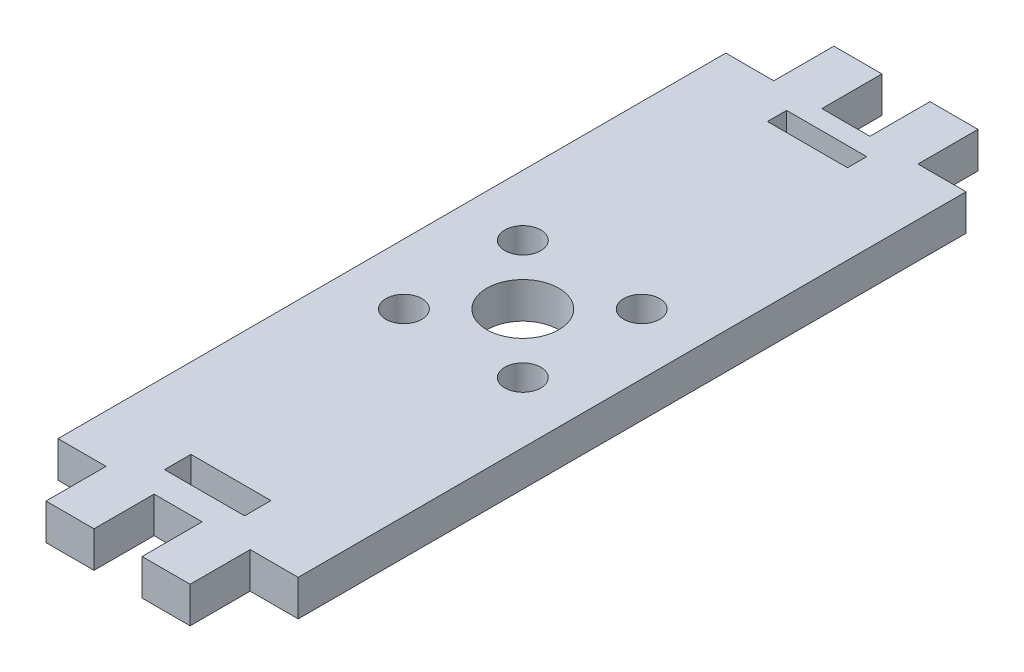
ISO-10303-21;
HEADER;
FILE_DESCRIPTION(('STEP AP214'),'2;1');
FILE_NAME('part.step','',(''),(''),'','','');
FILE_SCHEMA(('AUTOMOTIVE_DESIGN { 1 0 10303 214 1 1 1 1 }'));
ENDSEC;
DATA;
#1=APPLICATION_CONTEXT('core data for automotive mechanical design processes');
#2=APPLICATION_PROTOCOL_DEFINITION('international standard','automotive_design',2000,#1);
#3=PRODUCT_CONTEXT('',#1,'mechanical');
#4=PRODUCT('Part','Part','',(#3));
#5=PRODUCT_RELATED_PRODUCT_CATEGORY('part','',(#4));
#6=PRODUCT_DEFINITION_FORMATION('','',#4);
#7=PRODUCT_DEFINITION_CONTEXT('part definition',#1,'design');
#8=PRODUCT_DEFINITION('design','',#6,#7);
#9=PRODUCT_DEFINITION_SHAPE('','',#8);
#10=(LENGTH_UNIT() NAMED_UNIT(*) SI_UNIT(.MILLI.,.METRE.));
#11=(NAMED_UNIT(*) PLANE_ANGLE_UNIT() SI_UNIT($,.RADIAN.));
#12=(NAMED_UNIT(*) SI_UNIT($,.STERADIAN.) SOLID_ANGLE_UNIT());
#13=UNCERTAINTY_MEASURE_WITH_UNIT(LENGTH_MEASURE(1.E-05),#10,'distance_accuracy_value','');
#14=(GEOMETRIC_REPRESENTATION_CONTEXT(3) GLOBAL_UNCERTAINTY_ASSIGNED_CONTEXT((#13)) GLOBAL_UNIT_ASSIGNED_CONTEXT((#10,
#11,#12)) REPRESENTATION_CONTEXT('',''));
#15=CARTESIAN_POINT('',(0.,0.,0.));
#16=DIRECTION('',(0.,0.,1.));
#17=DIRECTION('',(1.,0.,0.));
#18=AXIS2_PLACEMENT_3D('',#15,#16,#17);
#19=CARTESIAN_POINT('',(-20.,3.,55.6));
#20=DIRECTION('',(0.,0.,-1.));
#21=DIRECTION('',(-1.,0.,0.));
#22=AXIS2_PLACEMENT_3D('',#19,#20,#21);
#23=PLANE('',#22);
#24=DIRECTION('',(0.,1.,0.));
#25=VECTOR('',#24,1.);
#26=CARTESIAN_POINT('',(-12.,0.,55.6));
#27=LINE('',#26,#25);
#28=CARTESIAN_POINT('',(-12.,0.,55.6));
#29=VERTEX_POINT('',#28);
#30=CARTESIAN_POINT('',(-12.,3.,55.6));
#31=VERTEX_POINT('',#30);
#32=EDGE_CURVE('E309',#29,#31,#27,.T.);
#33=ORIENTED_EDGE('',*,*,#32,.F.);
#34=DIRECTION('',(1.,0.,0.));
#35=VECTOR('',#34,1.);
#36=CARTESIAN_POINT('',(-20.,0.,55.6));
#37=LINE('',#36,#35);
#38=CARTESIAN_POINT('',(-8.,0.,55.6));
#39=VERTEX_POINT('',#38);
#40=EDGE_CURVE('E420',#29,#39,#37,.T.);
#41=ORIENTED_EDGE('',*,*,#40,.T.);
#42=DIRECTION('',(0.,1.,0.));
#43=VECTOR('',#42,1.);
#44=CARTESIAN_POINT('',(-8.,0.,55.6));
#45=LINE('',#44,#43);
#46=CARTESIAN_POINT('',(-8.,3.,55.6));
#47=VERTEX_POINT('',#46);
#48=EDGE_CURVE('E328',#39,#47,#45,.T.);
#49=ORIENTED_EDGE('',*,*,#48,.T.);
#50=DIRECTION('',(1.,0.,0.));
#51=VECTOR('',#50,1.);
#52=CARTESIAN_POINT('',(-20.,3.,55.6));
#53=LINE('',#52,#51);
#54=EDGE_CURVE('E406',#31,#47,#53,.T.);
#55=ORIENTED_EDGE('',*,*,#54,.F.);
#56=EDGE_LOOP('',(#33,#41,#49,#55));
#57=FACE_BOUND('',#56,.T.);
#58=ADVANCED_FACE('F40',(#57),#23,.F.);
#59=DIRECTION('',(0.,1.,0.));
#60=VECTOR('',#59,1.);
#61=CARTESIAN_POINT('',(-4.,0.,55.6));
#62=LINE('',#61,#60);
#63=CARTESIAN_POINT('',(-4.,0.,55.6));
#64=VERTEX_POINT('',#63);
#65=CARTESIAN_POINT('',(-4.,3.,55.6));
#66=VERTEX_POINT('',#65);
#67=EDGE_CURVE('E336',#64,#66,#62,.T.);
#68=ORIENTED_EDGE('',*,*,#67,.F.);
#69=CARTESIAN_POINT('',(0.,0.,55.6));
#70=VERTEX_POINT('',#69);
#71=EDGE_CURVE('E416',#64,#70,#37,.T.);
#72=ORIENTED_EDGE('',*,*,#71,.T.);
#73=DIRECTION('',(0.,-1.,0.));
#74=VECTOR('',#73,1.);
#75=CARTESIAN_POINT('',(0.,3.,55.6));
#76=LINE('',#75,#74);
#77=CARTESIAN_POINT('',(0.,3.,55.6));
#78=VERTEX_POINT('',#77);
#79=EDGE_CURVE('E431',#78,#70,#76,.T.);
#80=ORIENTED_EDGE('',*,*,#79,.F.);
#81=EDGE_CURVE('E400',#66,#78,#53,.T.);
#82=ORIENTED_EDGE('',*,*,#81,.F.);
#83=EDGE_LOOP('',(#68,#72,#80,#82));
#84=FACE_BOUND('',#83,.T.);
#85=ADVANCED_FACE('F485',(#84),#23,.F.);
#86=CARTESIAN_POINT('',(-20.,3.,0.));
#87=DIRECTION('',(0.,0.,1.));
#88=DIRECTION('',(1.,0.,0.));
#89=AXIS2_PLACEMENT_3D('',#86,#87,#88);
#90=PLANE('',#89);
#91=DIRECTION('',(0.,1.,0.));
#92=VECTOR('',#91,1.);
#93=CARTESIAN_POINT('',(-16.,0.,0.));
#94=LINE('',#93,#92);
#95=CARTESIAN_POINT('',(-16.,0.,0.));
#96=VERTEX_POINT('',#95);
#97=CARTESIAN_POINT('',(-16.,3.,0.));
#98=VERTEX_POINT('',#97);
#99=EDGE_CURVE('E363',#96,#98,#94,.T.);
#100=ORIENTED_EDGE('',*,*,#99,.F.);
#101=DIRECTION('',(-1.,0.,0.));
#102=VECTOR('',#101,1.);
#103=CARTESIAN_POINT('',(-20.,0.,0.));
#104=LINE('',#103,#102);
#105=CARTESIAN_POINT('',(-20.,0.,0.));
#106=VERTEX_POINT('',#105);
#107=EDGE_CURVE('E422',#96,#106,#104,.T.);
#108=ORIENTED_EDGE('',*,*,#107,.T.);
#109=DIRECTION('',(0.,-1.,0.));
#110=VECTOR('',#109,1.);
#111=CARTESIAN_POINT('',(-20.,3.,0.));
#112=LINE('',#111,#110);
#113=CARTESIAN_POINT('',(-20.,3.,0.));
#114=VERTEX_POINT('',#113);
#115=EDGE_CURVE('E412',#114,#106,#112,.T.);
#116=ORIENTED_EDGE('',*,*,#115,.F.);
#117=DIRECTION('',(-1.,0.,0.));
#118=VECTOR('',#117,1.);
#119=CARTESIAN_POINT('',(-20.,3.,0.));
#120=LINE('',#119,#118);
#121=EDGE_CURVE('E408',#98,#114,#120,.T.);
#122=ORIENTED_EDGE('',*,*,#121,.F.);
#123=EDGE_LOOP('',(#100,#108,#116,#122));
#124=FACE_BOUND('',#123,.T.);
#125=ADVANCED_FACE('F491',(#124),#90,.F.);
#126=CARTESIAN_POINT('',(-8.,0.,0.));
#127=VERTEX_POINT('',#126);
#128=CARTESIAN_POINT('',(-12.,0.,0.));
#129=VERTEX_POINT('',#128);
#130=EDGE_CURVE('E425',#127,#129,#104,.T.);
#131=ORIENTED_EDGE('',*,*,#130,.T.);
#132=DIRECTION('',(0.,1.,0.));
#133=VECTOR('',#132,1.);
#134=CARTESIAN_POINT('',(-12.,0.,0.));
#135=LINE('',#134,#133);
#136=CARTESIAN_POINT('',(-12.,3.,0.));
#137=VERTEX_POINT('',#136);
#138=EDGE_CURVE('E355',#129,#137,#135,.T.);
#139=ORIENTED_EDGE('',*,*,#138,.T.);
#140=CARTESIAN_POINT('',(-8.,3.,0.));
#141=VERTEX_POINT('',#140);
#142=EDGE_CURVE('E413',#141,#137,#120,.T.);
#143=ORIENTED_EDGE('',*,*,#142,.F.);
#144=DIRECTION('',(0.,1.,0.));
#145=VECTOR('',#144,1.);
#146=CARTESIAN_POINT('',(-8.,0.,0.));
#147=LINE('',#146,#145);
#148=EDGE_CURVE('E393',#127,#141,#147,.T.);
#149=ORIENTED_EDGE('',*,*,#148,.F.);
#150=EDGE_LOOP('',(#131,#139,#143,#149));
#151=FACE_BOUND('',#150,.T.);
#152=ADVANCED_FACE('F504',(#151),#90,.F.);
#153=CARTESIAN_POINT('',(-20.,3.,0.));
#154=DIRECTION('',(1.,0.,0.));
#155=DIRECTION('',(0.,0.,-1.));
#156=AXIS2_PLACEMENT_3D('',#153,#154,#155);
#157=PLANE('',#156);
#158=DIRECTION('',(0.,0.,1.));
#159=VECTOR('',#158,1.);
#160=CARTESIAN_POINT('',(-20.,0.,0.));
#161=LINE('',#160,#159);
#162=CARTESIAN_POINT('',(-20.,0.,55.6));
#163=VERTEX_POINT('',#162);
#164=EDGE_CURVE('E389',#106,#163,#161,.T.);
#165=ORIENTED_EDGE('',*,*,#164,.T.);
#166=DIRECTION('',(0.,-1.,0.));
#167=VECTOR('',#166,1.);
#168=CARTESIAN_POINT('',(-20.,3.,55.6));
#169=LINE('',#168,#167);
#170=CARTESIAN_POINT('',(-20.,3.,55.6));
#171=VERTEX_POINT('',#170);
#172=EDGE_CURVE('E434',#171,#163,#169,.T.);
#173=ORIENTED_EDGE('',*,*,#172,.F.);
#174=DIRECTION('',(0.,0.,1.));
#175=VECTOR('',#174,1.);
#176=CARTESIAN_POINT('',(-20.,3.,0.));
#177=LINE('',#176,#175);
#178=EDGE_CURVE('E397',#114,#171,#177,.T.);
#179=ORIENTED_EDGE('',*,*,#178,.F.);
#180=ORIENTED_EDGE('',*,*,#115,.T.);
#181=EDGE_LOOP('',(#165,#173,#179,#180));
#182=FACE_BOUND('',#181,.T.);
#183=ADVANCED_FACE('F42',(#182),#157,.F.);
#184=CARTESIAN_POINT('',(-16.,0.,55.6));
#185=VERTEX_POINT('',#184);
#186=EDGE_CURVE('E417',#163,#185,#37,.T.);
#187=ORIENTED_EDGE('',*,*,#186,.T.);
#188=DIRECTION('',(0.,1.,0.));
#189=VECTOR('',#188,1.);
#190=CARTESIAN_POINT('',(-16.,0.,55.6));
#191=LINE('',#190,#189);
#192=CARTESIAN_POINT('',(-16.,3.,55.6));
#193=VERTEX_POINT('',#192);
#194=EDGE_CURVE('E300',#185,#193,#191,.T.);
#195=ORIENTED_EDGE('',*,*,#194,.T.);
#196=EDGE_CURVE('E402',#171,#193,#53,.T.);
#197=ORIENTED_EDGE('',*,*,#196,.F.);
#198=ORIENTED_EDGE('',*,*,#172,.T.);
#199=EDGE_LOOP('',(#187,#195,#197,#198));
#200=FACE_BOUND('',#199,.T.);
#201=ADVANCED_FACE('F487',(#200),#23,.F.);
#202=CARTESIAN_POINT('',(0.,3.,0.));
#203=DIRECTION('',(-1.,0.,0.));
#204=DIRECTION('',(0.,0.,1.));
#205=AXIS2_PLACEMENT_3D('',#202,#203,#204);
#206=PLANE('',#205);
#207=DIRECTION('',(0.,0.,-1.));
#208=VECTOR('',#207,1.);
#209=CARTESIAN_POINT('',(0.,0.,0.));
#210=LINE('',#209,#208);
#211=CARTESIAN_POINT('',(0.,0.,0.));
#212=VERTEX_POINT('',#211);
#213=EDGE_CURVE('E419',#70,#212,#210,.T.);
#214=ORIENTED_EDGE('',*,*,#213,.T.);
#215=DIRECTION('',(0.,-1.,0.));
#216=VECTOR('',#215,1.);
#217=CARTESIAN_POINT('',(0.,3.,0.));
#218=LINE('',#217,#216);
#219=CARTESIAN_POINT('',(0.,3.,0.));
#220=VERTEX_POINT('',#219);
#221=EDGE_CURVE('E428',#220,#212,#218,.T.);
#222=ORIENTED_EDGE('',*,*,#221,.F.);
#223=DIRECTION('',(0.,0.,-1.));
#224=VECTOR('',#223,1.);
#225=CARTESIAN_POINT('',(0.,3.,0.));
#226=LINE('',#225,#224);
#227=EDGE_CURVE('E405',#78,#220,#226,.T.);
#228=ORIENTED_EDGE('',*,*,#227,.F.);
#229=ORIENTED_EDGE('',*,*,#79,.T.);
#230=EDGE_LOOP('',(#214,#222,#228,#229));
#231=FACE_BOUND('',#230,.T.);
#232=ADVANCED_FACE('F496',(#231),#206,.F.);
#233=CARTESIAN_POINT('',(-4.,0.,0.));
#234=VERTEX_POINT('',#233);
#235=EDGE_CURVE('E401',#212,#234,#104,.T.);
#236=ORIENTED_EDGE('',*,*,#235,.T.);
#237=DIRECTION('',(0.,1.,0.));
#238=VECTOR('',#237,1.);
#239=CARTESIAN_POINT('',(-4.,0.,0.));
#240=LINE('',#239,#238);
#241=CARTESIAN_POINT('',(-4.,3.,0.));
#242=VERTEX_POINT('',#241);
#243=EDGE_CURVE('E390',#234,#242,#240,.T.);
#244=ORIENTED_EDGE('',*,*,#243,.T.);
#245=EDGE_CURVE('E409',#220,#242,#120,.T.);
#246=ORIENTED_EDGE('',*,*,#245,.F.);
#247=ORIENTED_EDGE('',*,*,#221,.T.);
#248=EDGE_LOOP('',(#236,#244,#246,#247));
#249=FACE_BOUND('',#248,.T.);
#250=ADVANCED_FACE('F502',(#249),#90,.F.);
#251=CARTESIAN_POINT('',(0.,3.,0.));
#252=DIRECTION('',(0.,1.,0.));
#253=DIRECTION('',(0.,0.,1.));
#254=AXIS2_PLACEMENT_3D('',#251,#252,#253);
#255=PLANE('',#254);
#256=DIRECTION('',(-1.,0.,0.));
#257=VECTOR('',#256,1.);
#258=CARTESIAN_POINT('',(0.,3.,1.6));
#259=LINE('',#258,#257);
#260=CARTESIAN_POINT('',(-6.66666666666667,3.,1.6));
#261=VERTEX_POINT('',#260);
#262=CARTESIAN_POINT('',(-13.3333333333333,3.,1.6));
#263=VERTEX_POINT('',#262);
#264=EDGE_CURVE('E55',#261,#263,#259,.T.);
#265=ORIENTED_EDGE('',*,*,#264,.F.);
#266=DIRECTION('',(0.,0.,1.));
#267=VECTOR('',#266,1.);
#268=CARTESIAN_POINT('',(-6.66666666666667,3.,0.));
#269=LINE('',#268,#267);
#270=CARTESIAN_POINT('',(-6.66666666666667,3.,3.2));
#271=VERTEX_POINT('',#270);
#272=EDGE_CURVE('E249',#261,#271,#269,.T.);
#273=ORIENTED_EDGE('',*,*,#272,.T.);
#274=DIRECTION('',(-1.,0.,0.));
#275=VECTOR('',#274,1.);
#276=CARTESIAN_POINT('',(0.,3.,3.2));
#277=LINE('',#276,#275);
#278=CARTESIAN_POINT('',(-13.3333333333333,3.,3.2));
#279=VERTEX_POINT('',#278);
#280=EDGE_CURVE('E232',#271,#279,#277,.T.);
#281=ORIENTED_EDGE('',*,*,#280,.T.);
#282=DIRECTION('',(0.,0.,1.));
#283=VECTOR('',#282,1.);
#284=CARTESIAN_POINT('',(-13.3333333333333,3.,0.));
#285=LINE('',#284,#283);
#286=EDGE_CURVE('E242',#263,#279,#285,.T.);
#287=ORIENTED_EDGE('',*,*,#286,.F.);
#288=EDGE_LOOP('',(#265,#273,#281,#287));
#289=FACE_BOUND('',#288,.T.);
#290=DIRECTION('',(-1.,0.,0.));
#291=VECTOR('',#290,1.);
#292=CARTESIAN_POINT('',(0.,3.,51.2));
#293=LINE('',#292,#291);
#294=CARTESIAN_POINT('',(-6.66666666666666,3.,51.2));
#295=VERTEX_POINT('',#294);
#296=CARTESIAN_POINT('',(-13.3333333333333,3.,51.2));
#297=VERTEX_POINT('',#296);
#298=EDGE_CURVE('E63',#295,#297,#293,.T.);
#299=ORIENTED_EDGE('',*,*,#298,.F.);
#300=DIRECTION('',(0.,0.,1.));
#301=VECTOR('',#300,1.);
#302=CARTESIAN_POINT('',(-6.66666666666666,3.,0.));
#303=LINE('',#302,#301);
#304=CARTESIAN_POINT('',(-6.66666666666666,3.,53.4));
#305=VERTEX_POINT('',#304);
#306=EDGE_CURVE('E271',#295,#305,#303,.T.);
#307=ORIENTED_EDGE('',*,*,#306,.T.);
#308=DIRECTION('',(-1.,0.,0.));
#309=VECTOR('',#308,1.);
#310=CARTESIAN_POINT('',(0.,3.,53.4));
#311=LINE('',#310,#309);
#312=CARTESIAN_POINT('',(-13.3333333333333,3.,53.4));
#313=VERTEX_POINT('',#312);
#314=EDGE_CURVE('E268',#305,#313,#311,.T.);
#315=ORIENTED_EDGE('',*,*,#314,.T.);
#316=DIRECTION('',(0.,0.,1.));
#317=VECTOR('',#316,1.);
#318=CARTESIAN_POINT('',(-13.3333333333333,3.,0.));
#319=LINE('',#318,#317);
#320=EDGE_CURVE('E265',#297,#313,#319,.T.);
#321=ORIENTED_EDGE('',*,*,#320,.F.);
#322=EDGE_LOOP('',(#299,#307,#315,#321));
#323=FACE_BOUND('',#322,.T.);
#324=CARTESIAN_POINT('',(-14.9497474683058,3.,31.8497474683058));
#325=DIRECTION('',(0.,1.,0.));
#326=DIRECTION('',(0.,0.,1.));
#327=AXIS2_PLACEMENT_3D('',#324,#325,#326);
#328=CIRCLE('',#327,1.5);
#329=CARTESIAN_POINT('',(-14.9497474683058,3.,33.3497474683058));
#330=VERTEX_POINT('',#329);
#331=EDGE_CURVE('E259',#330,#330,#328,.T.);
#332=ORIENTED_EDGE('',*,*,#331,.F.);
#333=EDGE_LOOP('',(#332));
#334=FACE_BOUND('',#333,.T.);
#335=CARTESIAN_POINT('',(-14.9497474683058,3.,21.9502525316942));
#336=DIRECTION('',(0.,1.,0.));
#337=DIRECTION('',(0.,0.,1.));
#338=AXIS2_PLACEMENT_3D('',#335,#336,#337);
#339=CIRCLE('',#338,1.5);
#340=CARTESIAN_POINT('',(-14.9497474683058,3.,23.4502525316942));
#341=VERTEX_POINT('',#340);
#342=EDGE_CURVE('E262',#341,#341,#339,.T.);
#343=ORIENTED_EDGE('',*,*,#342,.F.);
#344=EDGE_LOOP('',(#343));
#345=FACE_BOUND('',#344,.T.);
#346=CARTESIAN_POINT('',(-10.,3.,26.9));
#347=DIRECTION('',(0.,1.,0.));
#348=DIRECTION('',(0.,0.,1.));
#349=AXIS2_PLACEMENT_3D('',#346,#347,#348);
#350=CIRCLE('',#349,3.);
#351=CARTESIAN_POINT('',(-10.,3.,29.9));
#352=VERTEX_POINT('',#351);
#353=EDGE_CURVE('E287',#352,#352,#350,.T.);
#354=ORIENTED_EDGE('',*,*,#353,.F.);
#355=EDGE_LOOP('',(#354));
#356=FACE_BOUND('',#355,.T.);
#357=CARTESIAN_POINT('',(-5.05025253169417,3.,31.8497474683058));
#358=DIRECTION('',(0.,1.,0.));
#359=DIRECTION('',(0.,0.,1.));
#360=AXIS2_PLACEMENT_3D('',#357,#358,#359);
#361=CIRCLE('',#360,1.5);
#362=CARTESIAN_POINT('',(-5.05025253169417,3.,33.3497474683058));
#363=VERTEX_POINT('',#362);
#364=EDGE_CURVE('E284',#363,#363,#361,.T.);
#365=ORIENTED_EDGE('',*,*,#364,.F.);
#366=EDGE_LOOP('',(#365));
#367=FACE_BOUND('',#366,.T.);
#368=CARTESIAN_POINT('',(-5.05025253169417,3.,21.9502525316942));
#369=DIRECTION('',(0.,1.,0.));
#370=DIRECTION('',(0.,0.,1.));
#371=AXIS2_PLACEMENT_3D('',#368,#369,#370);
#372=CIRCLE('',#371,1.5);
#373=CARTESIAN_POINT('',(-5.05025253169417,3.,23.4502525316942));
#374=VERTEX_POINT('',#373);
#375=EDGE_CURVE('E281',#374,#374,#372,.T.);
#376=ORIENTED_EDGE('',*,*,#375,.F.);
#377=EDGE_LOOP('',(#376));
#378=FACE_BOUND('',#377,.T.);
#379=ORIENTED_EDGE('',*,*,#178,.T.);
#380=ORIENTED_EDGE('',*,*,#196,.T.);
#381=DIRECTION('',(0.,0.,1.));
#382=VECTOR('',#381,1.);
#383=CARTESIAN_POINT('',(-16.,3.,0.));
#384=LINE('',#383,#382);
#385=CARTESIAN_POINT('',(-16.,3.,60.6));
#386=VERTEX_POINT('',#385);
#387=EDGE_CURVE('E301',#193,#386,#384,.T.);
#388=ORIENTED_EDGE('',*,*,#387,.T.);
#389=DIRECTION('',(-1.,0.,0.));
#390=VECTOR('',#389,1.);
#391=CARTESIAN_POINT('',(0.,3.,60.6));
#392=LINE('',#391,#390);
#393=CARTESIAN_POINT('',(-12.,3.,60.6));
#394=VERTEX_POINT('',#393);
#395=EDGE_CURVE('E304',#394,#386,#392,.T.);
#396=ORIENTED_EDGE('',*,*,#395,.F.);
#397=DIRECTION('',(0.,0.,1.));
#398=VECTOR('',#397,1.);
#399=CARTESIAN_POINT('',(-12.,3.,0.));
#400=LINE('',#399,#398);
#401=EDGE_CURVE('E296',#31,#394,#400,.T.);
#402=ORIENTED_EDGE('',*,*,#401,.F.);
#403=ORIENTED_EDGE('',*,*,#54,.T.);
#404=DIRECTION('',(0.,0.,1.));
#405=VECTOR('',#404,1.);
#406=CARTESIAN_POINT('',(-7.99999999999998,3.,0.));
#407=LINE('',#406,#405);
#408=CARTESIAN_POINT('',(-8.,3.,60.6));
#409=VERTEX_POINT('',#408);
#410=EDGE_CURVE('E312',#47,#409,#407,.T.);
#411=ORIENTED_EDGE('',*,*,#410,.T.);
#412=DIRECTION('',(1.,0.,0.));
#413=VECTOR('',#412,1.);
#414=CARTESIAN_POINT('',(0.,3.,60.6));
#415=LINE('',#414,#413);
#416=CARTESIAN_POINT('',(-4.,3.,60.6));
#417=VERTEX_POINT('',#416);
#418=EDGE_CURVE('E331',#409,#417,#415,.T.);
#419=ORIENTED_EDGE('',*,*,#418,.T.);
#420=DIRECTION('',(0.,0.,1.));
#421=VECTOR('',#420,1.);
#422=CARTESIAN_POINT('',(-4.,3.,0.));
#423=LINE('',#422,#421);
#424=EDGE_CURVE('E323',#66,#417,#423,.T.);
#425=ORIENTED_EDGE('',*,*,#424,.F.);
#426=ORIENTED_EDGE('',*,*,#81,.T.);
#427=ORIENTED_EDGE('',*,*,#227,.T.);
#428=ORIENTED_EDGE('',*,*,#245,.T.);
#429=DIRECTION('',(0.,0.,-1.));
#430=VECTOR('',#429,1.);
#431=CARTESIAN_POINT('',(-4.,3.,0.));
#432=LINE('',#431,#430);
#433=CARTESIAN_POINT('',(-4.,3.,-5.00000000000001));
#434=VERTEX_POINT('',#433);
#435=EDGE_CURVE('E375',#242,#434,#432,.T.);
#436=ORIENTED_EDGE('',*,*,#435,.T.);
#437=DIRECTION('',(1.,0.,0.));
#438=VECTOR('',#437,1.);
#439=CARTESIAN_POINT('',(0.,3.,-5.00000000000001));
#440=LINE('',#439,#438);
#441=CARTESIAN_POINT('',(-8.,3.,-5.00000000000001));
#442=VERTEX_POINT('',#441);
#443=EDGE_CURVE('E366',#442,#434,#440,.T.);
#444=ORIENTED_EDGE('',*,*,#443,.F.);
#445=DIRECTION('',(0.,0.,-1.));
#446=VECTOR('',#445,1.);
#447=CARTESIAN_POINT('',(-8.,3.,0.));
#448=LINE('',#447,#446);
#449=EDGE_CURVE('E383',#141,#442,#448,.T.);
#450=ORIENTED_EDGE('',*,*,#449,.F.);
#451=ORIENTED_EDGE('',*,*,#142,.T.);
#452=DIRECTION('',(0.,0.,-1.));
#453=VECTOR('',#452,1.);
#454=CARTESIAN_POINT('',(-12.,3.,0.));
#455=LINE('',#454,#453);
#456=CARTESIAN_POINT('',(-12.,3.,-5.00000000000001));
#457=VERTEX_POINT('',#456);
#458=EDGE_CURVE('E339',#137,#457,#455,.T.);
#459=ORIENTED_EDGE('',*,*,#458,.T.);
#460=DIRECTION('',(-1.,0.,0.));
#461=VECTOR('',#460,1.);
#462=CARTESIAN_POINT('',(0.,3.,-5.00000000000001));
#463=LINE('',#462,#461);
#464=CARTESIAN_POINT('',(-16.,3.,-5.00000000000001));
#465=VERTEX_POINT('',#464);
#466=EDGE_CURVE('E358',#457,#465,#463,.T.);
#467=ORIENTED_EDGE('',*,*,#466,.T.);
#468=DIRECTION('',(0.,0.,-1.));
#469=VECTOR('',#468,1.);
#470=CARTESIAN_POINT('',(-16.,3.,0.));
#471=LINE('',#470,#469);
#472=EDGE_CURVE('E350',#98,#465,#471,.T.);
#473=ORIENTED_EDGE('',*,*,#472,.F.);
#474=ORIENTED_EDGE('',*,*,#121,.T.);
#475=EDGE_LOOP('',(#379,#380,#388,#396,#402,#403,#411,#419,#425,#426,#427,#428,#436,#444,#450,
#451,#459,#467,#473,#474));
#476=FACE_BOUND('',#475,.T.);
#477=ADVANCED_FACE('F246',(#289,#323,#334,#345,#356,#367,#378,#476),#255,.T.);
#478=CARTESIAN_POINT('',(0.,0.,0.));
#479=DIRECTION('',(0.,1.,0.));
#480=DIRECTION('',(0.,0.,1.));
#481=AXIS2_PLACEMENT_3D('',#478,#479,#480);
#482=PLANE('',#481);
#483=DIRECTION('',(0.,0.,1.));
#484=VECTOR('',#483,1.);
#485=CARTESIAN_POINT('',(-6.66666666666667,0.,0.));
#486=LINE('',#485,#484);
#487=CARTESIAN_POINT('',(-6.66666666666667,0.,1.6));
#488=VERTEX_POINT('',#487);
#489=CARTESIAN_POINT('',(-6.66666666666667,0.,3.2));
#490=VERTEX_POINT('',#489);
#491=EDGE_CURVE('E48',#488,#490,#486,.T.);
#492=ORIENTED_EDGE('',*,*,#491,.F.);
#493=DIRECTION('',(-1.,0.,0.));
#494=VECTOR('',#493,1.);
#495=CARTESIAN_POINT('',(0.,0.,1.6));
#496=LINE('',#495,#494);
#497=CARTESIAN_POINT('',(-13.3333333333333,0.,1.6));
#498=VERTEX_POINT('',#497);
#499=EDGE_CURVE('E11',#488,#498,#496,.T.);
#500=ORIENTED_EDGE('',*,*,#499,.T.);
#501=DIRECTION('',(0.,0.,1.));
#502=VECTOR('',#501,1.);
#503=CARTESIAN_POINT('',(-13.3333333333333,0.,0.));
#504=LINE('',#503,#502);
#505=CARTESIAN_POINT('',(-13.3333333333333,0.,3.2));
#506=VERTEX_POINT('',#505);
#507=EDGE_CURVE('E461',#498,#506,#504,.T.);
#508=ORIENTED_EDGE('',*,*,#507,.T.);
#509=DIRECTION('',(-1.,0.,0.));
#510=VECTOR('',#509,1.);
#511=CARTESIAN_POINT('',(0.,0.,3.2));
#512=LINE('',#511,#510);
#513=EDGE_CURVE('E235',#490,#506,#512,.T.);
#514=ORIENTED_EDGE('',*,*,#513,.F.);
#515=EDGE_LOOP('',(#492,#500,#508,#514));
#516=FACE_BOUND('',#515,.T.);
#517=DIRECTION('',(0.,0.,1.));
#518=VECTOR('',#517,1.);
#519=CARTESIAN_POINT('',(-6.66666666666666,0.,0.));
#520=LINE('',#519,#518);
#521=CARTESIAN_POINT('',(-6.66666666666666,0.,51.2));
#522=VERTEX_POINT('',#521);
#523=CARTESIAN_POINT('',(-6.66666666666666,0.,53.4));
#524=VERTEX_POINT('',#523);
#525=EDGE_CURVE('E456',#522,#524,#520,.T.);
#526=ORIENTED_EDGE('',*,*,#525,.F.);
#527=DIRECTION('',(-1.,0.,0.));
#528=VECTOR('',#527,1.);
#529=CARTESIAN_POINT('',(0.,0.,51.2));
#530=LINE('',#529,#528);
#531=CARTESIAN_POINT('',(-13.3333333333333,0.,51.2));
#532=VERTEX_POINT('',#531);
#533=EDGE_CURVE('E458',#522,#532,#530,.T.);
#534=ORIENTED_EDGE('',*,*,#533,.T.);
#535=DIRECTION('',(0.,0.,1.));
#536=VECTOR('',#535,1.);
#537=CARTESIAN_POINT('',(-13.3333333333333,0.,0.));
#538=LINE('',#537,#536);
#539=CARTESIAN_POINT('',(-13.3333333333333,0.,53.4));
#540=VERTEX_POINT('',#539);
#541=EDGE_CURVE('E437',#532,#540,#538,.T.);
#542=ORIENTED_EDGE('',*,*,#541,.T.);
#543=DIRECTION('',(-1.,0.,0.));
#544=VECTOR('',#543,1.);
#545=CARTESIAN_POINT('',(0.,0.,53.4));
#546=LINE('',#545,#544);
#547=EDGE_CURVE('E453',#524,#540,#546,.T.);
#548=ORIENTED_EDGE('',*,*,#547,.F.);
#549=EDGE_LOOP('',(#526,#534,#542,#548));
#550=FACE_BOUND('',#549,.T.);
#551=CARTESIAN_POINT('',(-14.9497474683058,0.,31.8497474683058));
#552=DIRECTION('',(0.,1.,0.));
#553=DIRECTION('',(0.,0.,1.));
#554=AXIS2_PLACEMENT_3D('',#551,#552,#553);
#555=CIRCLE('',#554,1.5);
#556=CARTESIAN_POINT('',(-14.9497474683058,0.,33.3497474683058));
#557=VERTEX_POINT('',#556);
#558=EDGE_CURVE('E305',#557,#557,#555,.T.);
#559=ORIENTED_EDGE('',*,*,#558,.T.);
#560=EDGE_LOOP('',(#559));
#561=FACE_BOUND('',#560,.T.);
#562=CARTESIAN_POINT('',(-14.9497474683058,0.,21.9502525316942));
#563=DIRECTION('',(0.,1.,0.));
#564=DIRECTION('',(0.,0.,1.));
#565=AXIS2_PLACEMENT_3D('',#562,#563,#564);
#566=CIRCLE('',#565,1.5);
#567=CARTESIAN_POINT('',(-14.9497474683058,0.,23.4502525316942));
#568=VERTEX_POINT('',#567);
#569=EDGE_CURVE('E446',#568,#568,#566,.T.);
#570=ORIENTED_EDGE('',*,*,#569,.T.);
#571=EDGE_LOOP('',(#570));
#572=FACE_BOUND('',#571,.T.);
#573=CARTESIAN_POINT('',(-10.,0.,26.9));
#574=DIRECTION('',(0.,1.,0.));
#575=DIRECTION('',(0.,0.,1.));
#576=AXIS2_PLACEMENT_3D('',#573,#574,#575);
#577=CIRCLE('',#576,3.);
#578=CARTESIAN_POINT('',(-10.,0.,29.9));
#579=VERTEX_POINT('',#578);
#580=EDGE_CURVE('E443',#579,#579,#577,.T.);
#581=ORIENTED_EDGE('',*,*,#580,.T.);
#582=EDGE_LOOP('',(#581));
#583=FACE_BOUND('',#582,.T.);
#584=CARTESIAN_POINT('',(-5.05025253169417,0.,31.8497474683058));
#585=DIRECTION('',(0.,1.,0.));
#586=DIRECTION('',(0.,0.,1.));
#587=AXIS2_PLACEMENT_3D('',#584,#585,#586);
#588=CIRCLE('',#587,1.5);
#589=CARTESIAN_POINT('',(-5.05025253169417,0.,33.3497474683058));
#590=VERTEX_POINT('',#589);
#591=EDGE_CURVE('E440',#590,#590,#588,.T.);
#592=ORIENTED_EDGE('',*,*,#591,.T.);
#593=EDGE_LOOP('',(#592));
#594=FACE_BOUND('',#593,.T.);
#595=CARTESIAN_POINT('',(-5.05025253169417,0.,21.9502525316942));
#596=DIRECTION('',(0.,1.,0.));
#597=DIRECTION('',(0.,0.,1.));
#598=AXIS2_PLACEMENT_3D('',#595,#596,#597);
#599=CIRCLE('',#598,1.5);
#600=CARTESIAN_POINT('',(-5.05025253169417,0.,23.4502525316942));
#601=VERTEX_POINT('',#600);
#602=EDGE_CURVE('E256',#601,#601,#599,.T.);
#603=ORIENTED_EDGE('',*,*,#602,.T.);
#604=EDGE_LOOP('',(#603));
#605=FACE_BOUND('',#604,.T.);
#606=ORIENTED_EDGE('',*,*,#164,.F.);
#607=ORIENTED_EDGE('',*,*,#107,.F.);
#608=DIRECTION('',(0.,0.,-1.));
#609=VECTOR('',#608,1.);
#610=CARTESIAN_POINT('',(-16.,0.,0.));
#611=LINE('',#610,#609);
#612=CARTESIAN_POINT('',(-16.,0.,-5.00000000000001));
#613=VERTEX_POINT('',#612);
#614=EDGE_CURVE('E353',#96,#613,#611,.T.);
#615=ORIENTED_EDGE('',*,*,#614,.T.);
#616=DIRECTION('',(-1.,0.,0.));
#617=VECTOR('',#616,1.);
#618=CARTESIAN_POINT('',(0.,0.,-5.00000000000001));
#619=LINE('',#618,#617);
#620=CARTESIAN_POINT('',(-12.,0.,-5.00000000000001));
#621=VERTEX_POINT('',#620);
#622=EDGE_CURVE('E349',#621,#613,#619,.T.);
#623=ORIENTED_EDGE('',*,*,#622,.F.);
#624=DIRECTION('',(0.,0.,-1.));
#625=VECTOR('',#624,1.);
#626=CARTESIAN_POINT('',(-12.,0.,0.));
#627=LINE('',#626,#625);
#628=EDGE_CURVE('E346',#129,#621,#627,.T.);
#629=ORIENTED_EDGE('',*,*,#628,.F.);
#630=ORIENTED_EDGE('',*,*,#130,.F.);
#631=DIRECTION('',(0.,0.,-1.));
#632=VECTOR('',#631,1.);
#633=CARTESIAN_POINT('',(-8.,0.,0.));
#634=LINE('',#633,#632);
#635=CARTESIAN_POINT('',(-8.,0.,-5.00000000000001));
#636=VERTEX_POINT('',#635);
#637=EDGE_CURVE('E374',#127,#636,#634,.T.);
#638=ORIENTED_EDGE('',*,*,#637,.T.);
#639=DIRECTION('',(1.,0.,0.));
#640=VECTOR('',#639,1.);
#641=CARTESIAN_POINT('',(0.,0.,-5.00000000000001));
#642=LINE('',#641,#640);
#643=CARTESIAN_POINT('',(-4.,0.,-5.00000000000001));
#644=VERTEX_POINT('',#643);
#645=EDGE_CURVE('E372',#636,#644,#642,.T.);
#646=ORIENTED_EDGE('',*,*,#645,.T.);
#647=DIRECTION('',(0.,0.,-1.));
#648=VECTOR('',#647,1.);
#649=CARTESIAN_POINT('',(-4.,0.,0.));
#650=LINE('',#649,#648);
#651=EDGE_CURVE('E377',#234,#644,#650,.T.);
#652=ORIENTED_EDGE('',*,*,#651,.F.);
#653=ORIENTED_EDGE('',*,*,#235,.F.);
#654=ORIENTED_EDGE('',*,*,#213,.F.);
#655=ORIENTED_EDGE('',*,*,#71,.F.);
#656=DIRECTION('',(0.,0.,1.));
#657=VECTOR('',#656,1.);
#658=CARTESIAN_POINT('',(-4.,0.,0.));
#659=LINE('',#658,#657);
#660=CARTESIAN_POINT('',(-4.,0.,60.6));
#661=VERTEX_POINT('',#660);
#662=EDGE_CURVE('E326',#64,#661,#659,.T.);
#663=ORIENTED_EDGE('',*,*,#662,.T.);
#664=DIRECTION('',(1.,0.,0.));
#665=VECTOR('',#664,1.);
#666=CARTESIAN_POINT('',(0.,0.,60.6));
#667=LINE('',#666,#665);
#668=CARTESIAN_POINT('',(-8.,0.,60.6));
#669=VERTEX_POINT('',#668);
#670=EDGE_CURVE('E322',#669,#661,#667,.T.);
#671=ORIENTED_EDGE('',*,*,#670,.F.);
#672=DIRECTION('',(0.,0.,1.));
#673=VECTOR('',#672,1.);
#674=CARTESIAN_POINT('',(-7.99999999999998,0.,0.));
#675=LINE('',#674,#673);
#676=EDGE_CURVE('E319',#39,#669,#675,.T.);
#677=ORIENTED_EDGE('',*,*,#676,.F.);
#678=ORIENTED_EDGE('',*,*,#40,.F.);
#679=DIRECTION('',(0.,0.,1.));
#680=VECTOR('',#679,1.);
#681=CARTESIAN_POINT('',(-12.,0.,0.));
#682=LINE('',#681,#680);
#683=CARTESIAN_POINT('',(-12.,0.,60.6));
#684=VERTEX_POINT('',#683);
#685=EDGE_CURVE('E298',#29,#684,#682,.T.);
#686=ORIENTED_EDGE('',*,*,#685,.T.);
#687=DIRECTION('',(-1.,0.,0.));
#688=VECTOR('',#687,1.);
#689=CARTESIAN_POINT('',(0.,0.,60.6));
#690=LINE('',#689,#688);
#691=CARTESIAN_POINT('',(-16.,0.,60.6));
#692=VERTEX_POINT('',#691);
#693=EDGE_CURVE('E295',#684,#692,#690,.T.);
#694=ORIENTED_EDGE('',*,*,#693,.T.);
#695=DIRECTION('',(0.,0.,1.));
#696=VECTOR('',#695,1.);
#697=CARTESIAN_POINT('',(-16.,0.,0.));
#698=LINE('',#697,#696);
#699=EDGE_CURVE('E292',#185,#692,#698,.T.);
#700=ORIENTED_EDGE('',*,*,#699,.F.);
#701=ORIENTED_EDGE('',*,*,#186,.F.);
#702=EDGE_LOOP('',(#606,#607,#615,#623,#629,#630,#638,#646,#652,#653,#654,#655,#663,#671,#677,
#678,#686,#694,#700,#701));
#703=FACE_BOUND('',#702,.T.);
#704=ADVANCED_FACE('F468',(#516,#550,#561,#572,#583,#594,#605,#703),#482,.F.);
#705=CARTESIAN_POINT('',(0.,0.,-5.00000000000001));
#706=DIRECTION('',(0.,0.,1.));
#707=DIRECTION('',(1.,0.,0.));
#708=AXIS2_PLACEMENT_3D('',#705,#706,#707);
#709=PLANE('',#708);
#710=ORIENTED_EDGE('',*,*,#443,.T.);
#711=DIRECTION('',(0.,1.,0.));
#712=VECTOR('',#711,1.);
#713=CARTESIAN_POINT('',(-4.,0.,-5.00000000000001));
#714=LINE('',#713,#712);
#715=EDGE_CURVE('E387',#644,#434,#714,.T.);
#716=ORIENTED_EDGE('',*,*,#715,.F.);
#717=ORIENTED_EDGE('',*,*,#645,.F.);
#718=DIRECTION('',(0.,1.,0.));
#719=VECTOR('',#718,1.);
#720=CARTESIAN_POINT('',(-8.,0.,-5.00000000000001));
#721=LINE('',#720,#719);
#722=EDGE_CURVE('E380',#636,#442,#721,.T.);
#723=ORIENTED_EDGE('',*,*,#722,.T.);
#724=EDGE_LOOP('',(#710,#716,#717,#723));
#725=FACE_BOUND('',#724,.T.);
#726=ADVANCED_FACE('F553',(#725),#709,.F.);
#727=CARTESIAN_POINT('',(-4.,0.,0.));
#728=DIRECTION('',(1.,0.,0.));
#729=DIRECTION('',(0.,0.,-1.));
#730=AXIS2_PLACEMENT_3D('',#727,#728,#729);
#731=PLANE('',#730);
#732=ORIENTED_EDGE('',*,*,#435,.F.);
#733=ORIENTED_EDGE('',*,*,#243,.F.);
#734=ORIENTED_EDGE('',*,*,#651,.T.);
#735=ORIENTED_EDGE('',*,*,#715,.T.);
#736=EDGE_LOOP('',(#732,#733,#734,#735));
#737=FACE_BOUND('',#736,.T.);
#738=ADVANCED_FACE('F597',(#737),#731,.T.);
#739=CARTESIAN_POINT('',(-8.,0.,0.));
#740=DIRECTION('',(1.,0.,0.));
#741=DIRECTION('',(0.,0.,-1.));
#742=AXIS2_PLACEMENT_3D('',#739,#740,#741);
#743=PLANE('',#742);
#744=ORIENTED_EDGE('',*,*,#449,.T.);
#745=ORIENTED_EDGE('',*,*,#722,.F.);
#746=ORIENTED_EDGE('',*,*,#637,.F.);
#747=ORIENTED_EDGE('',*,*,#148,.T.);
#748=EDGE_LOOP('',(#744,#745,#746,#747));
#749=FACE_BOUND('',#748,.T.);
#750=ADVANCED_FACE('F550',(#749),#743,.F.);
#751=CARTESIAN_POINT('',(-16.,0.,0.));
#752=DIRECTION('',(1.,0.,0.));
#753=DIRECTION('',(0.,0.,-1.));
#754=AXIS2_PLACEMENT_3D('',#751,#752,#753);
#755=PLANE('',#754);
#756=ORIENTED_EDGE('',*,*,#472,.T.);
#757=DIRECTION('',(0.,1.,0.));
#758=VECTOR('',#757,1.);
#759=CARTESIAN_POINT('',(-16.,0.,-5.00000000000001));
#760=LINE('',#759,#758);
#761=EDGE_CURVE('E367',#613,#465,#760,.T.);
#762=ORIENTED_EDGE('',*,*,#761,.F.);
#763=ORIENTED_EDGE('',*,*,#614,.F.);
#764=ORIENTED_EDGE('',*,*,#99,.T.);
#765=EDGE_LOOP('',(#756,#762,#763,#764));
#766=FACE_BOUND('',#765,.T.);
#767=ADVANCED_FACE('F532',(#766),#755,.F.);
#768=CARTESIAN_POINT('',(0.,0.,-5.00000000000001));
#769=DIRECTION('',(0.,0.,-1.));
#770=DIRECTION('',(-1.,0.,0.));
#771=AXIS2_PLACEMENT_3D('',#768,#769,#770);
#772=PLANE('',#771);
#773=ORIENTED_EDGE('',*,*,#466,.F.);
#774=DIRECTION('',(0.,1.,0.));
#775=VECTOR('',#774,1.);
#776=CARTESIAN_POINT('',(-12.,0.,-5.00000000000001));
#777=LINE('',#776,#775);
#778=EDGE_CURVE('E369',#621,#457,#777,.T.);
#779=ORIENTED_EDGE('',*,*,#778,.F.);
#780=ORIENTED_EDGE('',*,*,#622,.T.);
#781=ORIENTED_EDGE('',*,*,#761,.T.);
#782=EDGE_LOOP('',(#773,#779,#780,#781));
#783=FACE_BOUND('',#782,.T.);
#784=ADVANCED_FACE('F535',(#783),#772,.T.);
#785=CARTESIAN_POINT('',(-12.,0.,0.));
#786=DIRECTION('',(1.,0.,0.));
#787=DIRECTION('',(0.,0.,-1.));
#788=AXIS2_PLACEMENT_3D('',#785,#786,#787);
#789=PLANE('',#788);
#790=ORIENTED_EDGE('',*,*,#458,.F.);
#791=ORIENTED_EDGE('',*,*,#138,.F.);
#792=ORIENTED_EDGE('',*,*,#628,.T.);
#793=ORIENTED_EDGE('',*,*,#778,.T.);
#794=EDGE_LOOP('',(#790,#791,#792,#793));
#795=FACE_BOUND('',#794,.T.);
#796=ADVANCED_FACE('F541',(#795),#789,.T.);
#797=CARTESIAN_POINT('',(-4.,0.,0.));
#798=DIRECTION('',(-1.,0.,0.));
#799=DIRECTION('',(0.,0.,1.));
#800=AXIS2_PLACEMENT_3D('',#797,#798,#799);
#801=PLANE('',#800);
#802=ORIENTED_EDGE('',*,*,#424,.T.);
#803=DIRECTION('',(0.,1.,0.));
#804=VECTOR('',#803,1.);
#805=CARTESIAN_POINT('',(-4.,0.,60.6));
#806=LINE('',#805,#804);
#807=EDGE_CURVE('E340',#661,#417,#806,.T.);
#808=ORIENTED_EDGE('',*,*,#807,.F.);
#809=ORIENTED_EDGE('',*,*,#662,.F.);
#810=ORIENTED_EDGE('',*,*,#67,.T.);
#811=EDGE_LOOP('',(#802,#808,#809,#810));
#812=FACE_BOUND('',#811,.T.);
#813=ADVANCED_FACE('F578',(#812),#801,.F.);
#814=CARTESIAN_POINT('',(0.,0.,60.6));
#815=DIRECTION('',(0.,0.,1.));
#816=DIRECTION('',(1.,0.,0.));
#817=AXIS2_PLACEMENT_3D('',#814,#815,#816);
#818=PLANE('',#817);
#819=ORIENTED_EDGE('',*,*,#418,.F.);
#820=DIRECTION('',(0.,1.,0.));
#821=VECTOR('',#820,1.);
#822=CARTESIAN_POINT('',(-8.,0.,60.6));
#823=LINE('',#822,#821);
#824=EDGE_CURVE('E342',#669,#409,#823,.T.);
#825=ORIENTED_EDGE('',*,*,#824,.F.);
#826=ORIENTED_EDGE('',*,*,#670,.T.);
#827=ORIENTED_EDGE('',*,*,#807,.T.);
#828=EDGE_LOOP('',(#819,#825,#826,#827));
#829=FACE_BOUND('',#828,.T.);
#830=ADVANCED_FACE('F575',(#829),#818,.T.);
#831=CARTESIAN_POINT('',(-7.99999999999998,0.,0.));
#832=DIRECTION('',(-1.,0.,0.));
#833=DIRECTION('',(0.,0.,1.));
#834=AXIS2_PLACEMENT_3D('',#831,#832,#833);
#835=PLANE('',#834);
#836=ORIENTED_EDGE('',*,*,#410,.F.);
#837=ORIENTED_EDGE('',*,*,#48,.F.);
#838=ORIENTED_EDGE('',*,*,#676,.T.);
#839=ORIENTED_EDGE('',*,*,#824,.T.);
#840=EDGE_LOOP('',(#836,#837,#838,#839));
#841=FACE_BOUND('',#840,.T.);
#842=ADVANCED_FACE('F572',(#841),#835,.T.);
#843=CARTESIAN_POINT('',(-12.,0.,0.));
#844=DIRECTION('',(-1.,0.,0.));
#845=DIRECTION('',(0.,0.,1.));
#846=AXIS2_PLACEMENT_3D('',#843,#844,#845);
#847=PLANE('',#846);
#848=ORIENTED_EDGE('',*,*,#401,.T.);
#849=DIRECTION('',(0.,1.,0.));
#850=VECTOR('',#849,1.);
#851=CARTESIAN_POINT('',(-12.,0.,60.6));
#852=LINE('',#851,#850);
#853=EDGE_CURVE('E313',#684,#394,#852,.T.);
#854=ORIENTED_EDGE('',*,*,#853,.F.);
#855=ORIENTED_EDGE('',*,*,#685,.F.);
#856=ORIENTED_EDGE('',*,*,#32,.T.);
#857=EDGE_LOOP('',(#848,#854,#855,#856));
#858=FACE_BOUND('',#857,.T.);
#859=ADVANCED_FACE('F592',(#858),#847,.F.);
#860=CARTESIAN_POINT('',(0.,0.,60.6));
#861=DIRECTION('',(0.,0.,-1.));
#862=DIRECTION('',(-1.,0.,0.));
#863=AXIS2_PLACEMENT_3D('',#860,#861,#862);
#864=PLANE('',#863);
#865=ORIENTED_EDGE('',*,*,#395,.T.);
#866=DIRECTION('',(0.,1.,0.));
#867=VECTOR('',#866,1.);
#868=CARTESIAN_POINT('',(-16.,0.,60.6));
#869=LINE('',#868,#867);
#870=EDGE_CURVE('E316',#692,#386,#869,.T.);
#871=ORIENTED_EDGE('',*,*,#870,.F.);
#872=ORIENTED_EDGE('',*,*,#693,.F.);
#873=ORIENTED_EDGE('',*,*,#853,.T.);
#874=EDGE_LOOP('',(#865,#871,#872,#873));
#875=FACE_BOUND('',#874,.T.);
#876=ADVANCED_FACE('F519',(#875),#864,.F.);
#877=CARTESIAN_POINT('',(-16.,0.,0.));
#878=DIRECTION('',(-1.,0.,0.));
#879=DIRECTION('',(0.,0.,1.));
#880=AXIS2_PLACEMENT_3D('',#877,#878,#879);
#881=PLANE('',#880);
#882=ORIENTED_EDGE('',*,*,#387,.F.);
#883=ORIENTED_EDGE('',*,*,#194,.F.);
#884=ORIENTED_EDGE('',*,*,#699,.T.);
#885=ORIENTED_EDGE('',*,*,#870,.T.);
#886=EDGE_LOOP('',(#882,#883,#884,#885));
#887=FACE_BOUND('',#886,.T.);
#888=ADVANCED_FACE('F513',(#887),#881,.T.);
#889=CARTESIAN_POINT('',(-5.05025253169417,-7.,21.9502525316942));
#890=DIRECTION('',(0.,1.,0.));
#891=DIRECTION('',(0.,0.,1.));
#892=AXIS2_PLACEMENT_3D('',#889,#890,#891);
#893=CYLINDRICAL_SURFACE('',#892,1.5);
#894=ORIENTED_EDGE('',*,*,#375,.T.);
#895=EDGE_LOOP('',(#894));
#896=FACE_BOUND('',#895,.T.);
#897=ORIENTED_EDGE('',*,*,#602,.F.);
#898=EDGE_LOOP('',(#897));
#899=FACE_BOUND('',#898,.T.);
#900=ADVANCED_FACE('F742',(#896,#899),#893,.F.);
#901=CARTESIAN_POINT('',(-5.05025253169417,-7.,31.8497474683058));
#902=DIRECTION('',(0.,1.,0.));
#903=DIRECTION('',(0.,0.,1.));
#904=AXIS2_PLACEMENT_3D('',#901,#902,#903);
#905=CYLINDRICAL_SURFACE('',#904,1.5);
#906=ORIENTED_EDGE('',*,*,#364,.T.);
#907=EDGE_LOOP('',(#906));
#908=FACE_BOUND('',#907,.T.);
#909=ORIENTED_EDGE('',*,*,#591,.F.);
#910=EDGE_LOOP('',(#909));
#911=FACE_BOUND('',#910,.T.);
#912=ADVANCED_FACE('F762',(#908,#911),#905,.F.);
#913=CARTESIAN_POINT('',(-10.,-7.,26.9));
#914=DIRECTION('',(0.,1.,0.));
#915=DIRECTION('',(0.,0.,1.));
#916=AXIS2_PLACEMENT_3D('',#913,#914,#915);
#917=CYLINDRICAL_SURFACE('',#916,3.);
#918=ORIENTED_EDGE('',*,*,#353,.T.);
#919=EDGE_LOOP('',(#918));
#920=FACE_BOUND('',#919,.T.);
#921=ORIENTED_EDGE('',*,*,#580,.F.);
#922=EDGE_LOOP('',(#921));
#923=FACE_BOUND('',#922,.T.);
#924=ADVANCED_FACE('F772',(#920,#923),#917,.F.);
#925=CARTESIAN_POINT('',(-14.9497474683058,-7.,21.9502525316942));
#926=DIRECTION('',(0.,1.,0.));
#927=DIRECTION('',(0.,0.,1.));
#928=AXIS2_PLACEMENT_3D('',#925,#926,#927);
#929=CYLINDRICAL_SURFACE('',#928,1.5);
#930=ORIENTED_EDGE('',*,*,#342,.T.);
#931=EDGE_LOOP('',(#930));
#932=FACE_BOUND('',#931,.T.);
#933=ORIENTED_EDGE('',*,*,#569,.F.);
#934=EDGE_LOOP('',(#933));
#935=FACE_BOUND('',#934,.T.);
#936=ADVANCED_FACE('F782',(#932,#935),#929,.F.);
#937=CARTESIAN_POINT('',(-14.9497474683058,-7.,31.8497474683058));
#938=DIRECTION('',(0.,1.,0.));
#939=DIRECTION('',(0.,0.,1.));
#940=AXIS2_PLACEMENT_3D('',#937,#938,#939);
#941=CYLINDRICAL_SURFACE('',#940,1.5);
#942=ORIENTED_EDGE('',*,*,#331,.T.);
#943=EDGE_LOOP('',(#942));
#944=FACE_BOUND('',#943,.T.);
#945=ORIENTED_EDGE('',*,*,#558,.F.);
#946=EDGE_LOOP('',(#945));
#947=FACE_BOUND('',#946,.T.);
#948=ADVANCED_FACE('F792',(#944,#947),#941,.F.);
#949=CARTESIAN_POINT('',(0.,-7.,51.2));
#950=DIRECTION('',(0.,0.,-1.));
#951=DIRECTION('',(-1.,0.,0.));
#952=AXIS2_PLACEMENT_3D('',#949,#950,#951);
#953=PLANE('',#952);
#954=DIRECTION('',(0.,1.,0.));
#955=VECTOR('',#954,1.);
#956=CARTESIAN_POINT('',(-6.66666666666666,-7.,51.2));
#957=LINE('',#956,#955);
#958=EDGE_CURVE('E263',#522,#295,#957,.T.);
#959=ORIENTED_EDGE('',*,*,#958,.T.);
#960=ORIENTED_EDGE('',*,*,#298,.T.);
#961=DIRECTION('',(0.,1.,0.));
#962=VECTOR('',#961,1.);
#963=CARTESIAN_POINT('',(-13.3333333333333,-7.,51.2));
#964=LINE('',#963,#962);
#965=EDGE_CURVE('E274',#532,#297,#964,.T.);
#966=ORIENTED_EDGE('',*,*,#965,.F.);
#967=ORIENTED_EDGE('',*,*,#533,.F.);
#968=EDGE_LOOP('',(#959,#960,#966,#967));
#969=FACE_BOUND('',#968,.T.);
#970=ADVANCED_FACE('F802',(#969),#953,.F.);
#971=CARTESIAN_POINT('',(-6.66666666666666,-7.,0.));
#972=DIRECTION('',(-1.,0.,0.));
#973=DIRECTION('',(0.,0.,1.));
#974=AXIS2_PLACEMENT_3D('',#971,#972,#973);
#975=PLANE('',#974);
#976=ORIENTED_EDGE('',*,*,#525,.T.);
#977=DIRECTION('',(0.,1.,0.));
#978=VECTOR('',#977,1.);
#979=CARTESIAN_POINT('',(-6.66666666666666,-7.,53.4));
#980=LINE('',#979,#978);
#981=EDGE_CURVE('E276',#524,#305,#980,.T.);
#982=ORIENTED_EDGE('',*,*,#981,.T.);
#983=ORIENTED_EDGE('',*,*,#306,.F.);
#984=ORIENTED_EDGE('',*,*,#958,.F.);
#985=EDGE_LOOP('',(#976,#982,#983,#984));
#986=FACE_BOUND('',#985,.T.);
#987=ADVANCED_FACE('F811',(#986),#975,.T.);
#988=CARTESIAN_POINT('',(0.,-7.,53.4));
#989=DIRECTION('',(0.,0.,-1.));
#990=DIRECTION('',(-1.,0.,0.));
#991=AXIS2_PLACEMENT_3D('',#988,#989,#990);
#992=PLANE('',#991);
#993=ORIENTED_EDGE('',*,*,#547,.T.);
#994=DIRECTION('',(0.,1.,0.));
#995=VECTOR('',#994,1.);
#996=CARTESIAN_POINT('',(-13.3333333333333,-7.,53.4));
#997=LINE('',#996,#995);
#998=EDGE_CURVE('E278',#540,#313,#997,.T.);
#999=ORIENTED_EDGE('',*,*,#998,.T.);
#1000=ORIENTED_EDGE('',*,*,#314,.F.);
#1001=ORIENTED_EDGE('',*,*,#981,.F.);
#1002=EDGE_LOOP('',(#993,#999,#1000,#1001));
#1003=FACE_BOUND('',#1002,.T.);
#1004=ADVANCED_FACE('F479',(#1003),#992,.T.);
#1005=CARTESIAN_POINT('',(-13.3333333333333,-7.,0.));
#1006=DIRECTION('',(-1.,0.,0.));
#1007=DIRECTION('',(0.,0.,1.));
#1008=AXIS2_PLACEMENT_3D('',#1005,#1006,#1007);
#1009=PLANE('',#1008);
#1010=ORIENTED_EDGE('',*,*,#965,.T.);
#1011=ORIENTED_EDGE('',*,*,#320,.T.);
#1012=ORIENTED_EDGE('',*,*,#998,.F.);
#1013=ORIENTED_EDGE('',*,*,#541,.F.);
#1014=EDGE_LOOP('',(#1010,#1011,#1012,#1013));
#1015=FACE_BOUND('',#1014,.T.);
#1016=ADVANCED_FACE('F472',(#1015),#1009,.F.);
#1017=CARTESIAN_POINT('',(0.,-7.,1.6));
#1018=DIRECTION('',(0.,0.,-1.));
#1019=DIRECTION('',(-1.,0.,0.));
#1020=AXIS2_PLACEMENT_3D('',#1017,#1018,#1019);
#1021=PLANE('',#1020);
#1022=DIRECTION('',(0.,1.,0.));
#1023=VECTOR('',#1022,1.);
#1024=CARTESIAN_POINT('',(-6.66666666666667,-7.,1.6));
#1025=LINE('',#1024,#1023);
#1026=EDGE_CURVE('E254',#488,#261,#1025,.T.);
#1027=ORIENTED_EDGE('',*,*,#1026,.T.);
#1028=ORIENTED_EDGE('',*,*,#264,.T.);
#1029=DIRECTION('',(0.,1.,0.));
#1030=VECTOR('',#1029,1.);
#1031=CARTESIAN_POINT('',(-13.3333333333333,-7.,1.6));
#1032=LINE('',#1031,#1030);
#1033=EDGE_CURVE('E239',#498,#263,#1032,.T.);
#1034=ORIENTED_EDGE('',*,*,#1033,.F.);
#1035=ORIENTED_EDGE('',*,*,#499,.F.);
#1036=EDGE_LOOP('',(#1027,#1028,#1034,#1035));
#1037=FACE_BOUND('',#1036,.T.);
#1038=ADVANCED_FACE('F470',(#1037),#1021,.F.);
#1039=CARTESIAN_POINT('',(-6.66666666666667,-7.,0.));
#1040=DIRECTION('',(-1.,0.,0.));
#1041=DIRECTION('',(0.,0.,1.));
#1042=AXIS2_PLACEMENT_3D('',#1039,#1040,#1041);
#1043=PLANE('',#1042);
#1044=ORIENTED_EDGE('',*,*,#491,.T.);
#1045=DIRECTION('',(0.,1.,0.));
#1046=VECTOR('',#1045,1.);
#1047=CARTESIAN_POINT('',(-6.66666666666667,-7.,3.2));
#1048=LINE('',#1047,#1046);
#1049=EDGE_CURVE('E238',#490,#271,#1048,.T.);
#1050=ORIENTED_EDGE('',*,*,#1049,.T.);
#1051=ORIENTED_EDGE('',*,*,#272,.F.);
#1052=ORIENTED_EDGE('',*,*,#1026,.F.);
#1053=EDGE_LOOP('',(#1044,#1050,#1051,#1052));
#1054=FACE_BOUND('',#1053,.T.);
#1055=ADVANCED_FACE('F466',(#1054),#1043,.T.);
#1056=CARTESIAN_POINT('',(0.,-7.,3.2));
#1057=DIRECTION('',(0.,0.,-1.));
#1058=DIRECTION('',(-1.,0.,0.));
#1059=AXIS2_PLACEMENT_3D('',#1056,#1057,#1058);
#1060=PLANE('',#1059);
#1061=ORIENTED_EDGE('',*,*,#513,.T.);
#1062=DIRECTION('',(0.,1.,0.));
#1063=VECTOR('',#1062,1.);
#1064=CARTESIAN_POINT('',(-13.3333333333333,-7.,3.2));
#1065=LINE('',#1064,#1063);
#1066=EDGE_CURVE('E227',#506,#279,#1065,.T.);
#1067=ORIENTED_EDGE('',*,*,#1066,.T.);
#1068=ORIENTED_EDGE('',*,*,#280,.F.);
#1069=ORIENTED_EDGE('',*,*,#1049,.F.);
#1070=EDGE_LOOP('',(#1061,#1067,#1068,#1069));
#1071=FACE_BOUND('',#1070,.T.);
#1072=ADVANCED_FACE('F229',(#1071),#1060,.T.);
#1073=CARTESIAN_POINT('',(-13.3333333333333,-7.,0.));
#1074=DIRECTION('',(-1.,0.,0.));
#1075=DIRECTION('',(0.,0.,1.));
#1076=AXIS2_PLACEMENT_3D('',#1073,#1074,#1075);
#1077=PLANE('',#1076);
#1078=ORIENTED_EDGE('',*,*,#1033,.T.);
#1079=ORIENTED_EDGE('',*,*,#286,.T.);
#1080=ORIENTED_EDGE('',*,*,#1066,.F.);
#1081=ORIENTED_EDGE('',*,*,#507,.F.);
#1082=EDGE_LOOP('',(#1078,#1079,#1080,#1081));
#1083=FACE_BOUND('',#1082,.T.);
#1084=ADVANCED_FACE('F243',(#1083),#1077,.F.);
#1085=CLOSED_SHELL('',(#58,#85,#125,#152,#183,#201,#232,#250,#477,#704,#726,#738,#750,#767,#784,
#796,#813,#830,#842,#859,#876,#888,#900,#912,#924,#936,#948,#970,#987,#1004,#1016,#1038,#1055,
#1072,#1084));
#1086=MANIFOLD_SOLID_BREP('B2',#1085);
#1087=ADVANCED_BREP_SHAPE_REPRESENTATION('',(#18,#1086),#14);
#1088=SHAPE_DEFINITION_REPRESENTATION(#9,#1087);
ENDSEC;
END-ISO-10303-21;
